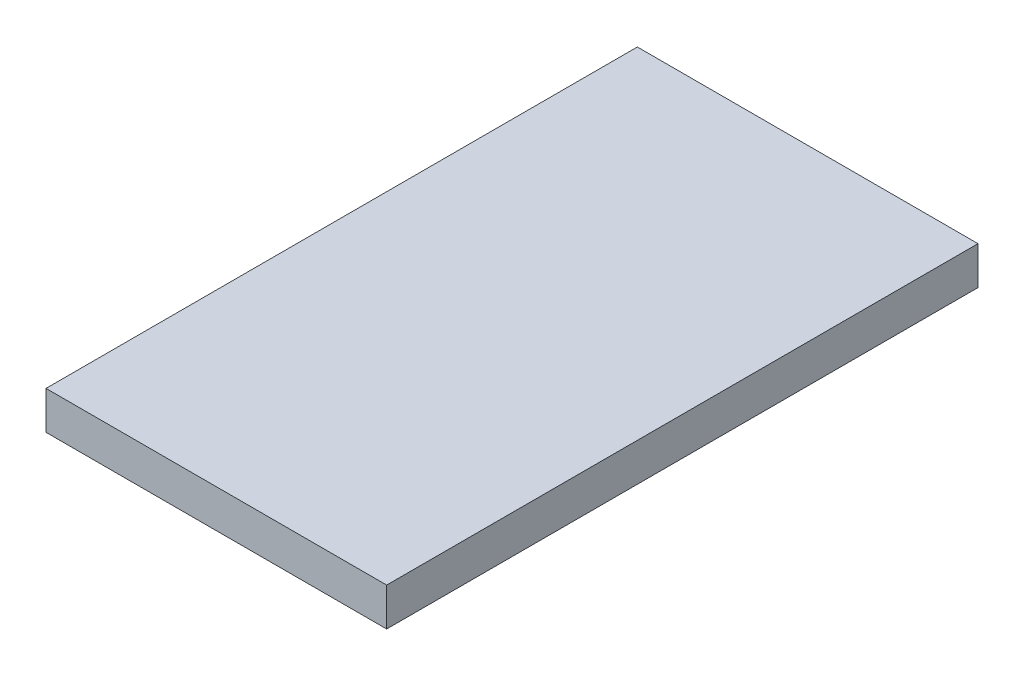
ISO-10303-21;
HEADER;
FILE_DESCRIPTION(('STEP AP214'),'2;1');
FILE_NAME('part.step','',(''),(''),'','','');
FILE_SCHEMA(('AUTOMOTIVE_DESIGN { 1 0 10303 214 1 1 1 1 }'));
ENDSEC;
DATA;
#1=APPLICATION_CONTEXT('core data for automotive mechanical design processes');
#2=APPLICATION_PROTOCOL_DEFINITION('international standard','automotive_design',2000,#1);
#3=PRODUCT_CONTEXT('',#1,'mechanical');
#4=PRODUCT('Part','Part','',(#3));
#5=PRODUCT_RELATED_PRODUCT_CATEGORY('part','',(#4));
#6=PRODUCT_DEFINITION_FORMATION('','',#4);
#7=PRODUCT_DEFINITION_CONTEXT('part definition',#1,'design');
#8=PRODUCT_DEFINITION('design','',#6,#7);
#9=PRODUCT_DEFINITION_SHAPE('','',#8);
#10=(LENGTH_UNIT() NAMED_UNIT(*) SI_UNIT(.MILLI.,.METRE.));
#11=(NAMED_UNIT(*) PLANE_ANGLE_UNIT() SI_UNIT($,.RADIAN.));
#12=(NAMED_UNIT(*) SI_UNIT($,.STERADIAN.) SOLID_ANGLE_UNIT());
#13=UNCERTAINTY_MEASURE_WITH_UNIT(LENGTH_MEASURE(1.E-05),#10,'distance_accuracy_value','');
#14=(GEOMETRIC_REPRESENTATION_CONTEXT(3) GLOBAL_UNCERTAINTY_ASSIGNED_CONTEXT((#13)) GLOBAL_UNIT_ASSIGNED_CONTEXT((#10,
#11,#12)) REPRESENTATION_CONTEXT('',''));
#15=CARTESIAN_POINT('',(0.,0.,0.));
#16=DIRECTION('',(0.,0.,1.));
#17=DIRECTION('',(1.,0.,0.));
#18=AXIS2_PLACEMENT_3D('',#15,#16,#17);
#19=CARTESIAN_POINT('',(-8.94715829199962,2.,-15.5309162804522));
#20=DIRECTION('',(0.,0.,-1.));
#21=DIRECTION('',(-1.,0.,0.));
#22=AXIS2_PLACEMENT_3D('',#19,#20,#21);
#23=PLANE('',#22);
#24=DIRECTION('',(1.,0.,0.));
#25=VECTOR('',#24,1.);
#26=CARTESIAN_POINT('',(-8.94715829199962,0.,-15.5309162804522));
#27=LINE('',#26,#25);
#28=CARTESIAN_POINT('',(-8.94715829199962,0.,-15.5309162804522));
#29=VERTEX_POINT('',#28);
#30=CARTESIAN_POINT('',(8.94715829199962,0.,-15.5309162804522));
#31=VERTEX_POINT('',#30);
#32=EDGE_CURVE('E116',#29,#31,#27,.T.);
#33=ORIENTED_EDGE('',*,*,#32,.F.);
#34=DIRECTION('',(0.,-1.,0.));
#35=VECTOR('',#34,1.);
#36=CARTESIAN_POINT('',(-8.94715829199962,2.,-15.5309162804522));
#37=LINE('',#36,#35);
#38=CARTESIAN_POINT('',(-8.94715829199962,2.,-15.5309162804522));
#39=VERTEX_POINT('',#38);
#40=EDGE_CURVE('E11',#39,#29,#37,.T.);
#41=ORIENTED_EDGE('',*,*,#40,.F.);
#42=DIRECTION('',(1.,0.,0.));
#43=VECTOR('',#42,1.);
#44=CARTESIAN_POINT('',(-8.94715829199962,2.,-15.5309162804522));
#45=LINE('',#44,#43);
#46=CARTESIAN_POINT('',(8.94715829199962,2.,-15.5309162804522));
#47=VERTEX_POINT('',#46);
#48=EDGE_CURVE('E109',#39,#47,#45,.T.);
#49=ORIENTED_EDGE('',*,*,#48,.T.);
#50=DIRECTION('',(0.,-1.,0.));
#51=VECTOR('',#50,1.);
#52=CARTESIAN_POINT('',(8.94715829199962,2.,-15.5309162804522));
#53=LINE('',#52,#51);
#54=EDGE_CURVE('E48',#47,#31,#53,.T.);
#55=ORIENTED_EDGE('',*,*,#54,.T.);
#56=EDGE_LOOP('',(#33,#41,#49,#55));
#57=FACE_BOUND('',#56,.T.);
#58=ADVANCED_FACE('F45',(#57),#23,.T.);
#59=CARTESIAN_POINT('',(-8.94715829199962,2.,-15.5309162804522));
#60=DIRECTION('',(1.,0.,0.));
#61=DIRECTION('',(0.,0.,-1.));
#62=AXIS2_PLACEMENT_3D('',#59,#60,#61);
#63=PLANE('',#62);
#64=DIRECTION('',(0.,0.,1.));
#65=VECTOR('',#64,1.);
#66=CARTESIAN_POINT('',(-8.94715829199962,0.,-15.5309162804522));
#67=LINE('',#66,#65);
#68=CARTESIAN_POINT('',(-8.94715829199962,0.,15.5309162804522));
#69=VERTEX_POINT('',#68);
#70=EDGE_CURVE('E79',#29,#69,#67,.T.);
#71=ORIENTED_EDGE('',*,*,#70,.T.);
#72=DIRECTION('',(0.,-1.,0.));
#73=VECTOR('',#72,1.);
#74=CARTESIAN_POINT('',(-8.94715829199962,2.,15.5309162804522));
#75=LINE('',#74,#73);
#76=CARTESIAN_POINT('',(-8.94715829199962,2.,15.5309162804522));
#77=VERTEX_POINT('',#76);
#78=EDGE_CURVE('E55',#77,#69,#75,.T.);
#79=ORIENTED_EDGE('',*,*,#78,.F.);
#80=DIRECTION('',(0.,0.,1.));
#81=VECTOR('',#80,1.);
#82=CARTESIAN_POINT('',(-8.94715829199962,2.,-15.5309162804522));
#83=LINE('',#82,#81);
#84=EDGE_CURVE('E96',#39,#77,#83,.T.);
#85=ORIENTED_EDGE('',*,*,#84,.F.);
#86=ORIENTED_EDGE('',*,*,#40,.T.);
#87=EDGE_LOOP('',(#71,#79,#85,#86));
#88=FACE_BOUND('',#87,.T.);
#89=ADVANCED_FACE('F132',(#88),#63,.F.);
#90=CARTESIAN_POINT('',(-8.94715829199962,2.,15.5309162804522));
#91=DIRECTION('',(0.,0.,-1.));
#92=DIRECTION('',(-1.,0.,0.));
#93=AXIS2_PLACEMENT_3D('',#90,#91,#92);
#94=PLANE('',#93);
#95=DIRECTION('',(1.,0.,0.));
#96=VECTOR('',#95,1.);
#97=CARTESIAN_POINT('',(-8.94715829199962,0.,15.5309162804522));
#98=LINE('',#97,#96);
#99=CARTESIAN_POINT('',(8.94715829199962,0.,15.5309162804522));
#100=VERTEX_POINT('',#99);
#101=EDGE_CURVE('E104',#69,#100,#98,.T.);
#102=ORIENTED_EDGE('',*,*,#101,.T.);
#103=DIRECTION('',(0.,-1.,0.));
#104=VECTOR('',#103,1.);
#105=CARTESIAN_POINT('',(8.94715829199962,2.,15.5309162804522));
#106=LINE('',#105,#104);
#107=CARTESIAN_POINT('',(8.94715829199962,2.,15.5309162804522));
#108=VERTEX_POINT('',#107);
#109=EDGE_CURVE('E101',#108,#100,#106,.T.);
#110=ORIENTED_EDGE('',*,*,#109,.F.);
#111=DIRECTION('',(1.,0.,0.));
#112=VECTOR('',#111,1.);
#113=CARTESIAN_POINT('',(-8.94715829199962,2.,15.5309162804522));
#114=LINE('',#113,#112);
#115=EDGE_CURVE('E91',#77,#108,#114,.T.);
#116=ORIENTED_EDGE('',*,*,#115,.F.);
#117=ORIENTED_EDGE('',*,*,#78,.T.);
#118=EDGE_LOOP('',(#102,#110,#116,#117));
#119=FACE_BOUND('',#118,.T.);
#120=ADVANCED_FACE('F102',(#119),#94,.F.);
#121=CARTESIAN_POINT('',(8.94715829199962,2.,-15.5309162804522));
#122=DIRECTION('',(1.,0.,0.));
#123=DIRECTION('',(0.,0.,-1.));
#124=AXIS2_PLACEMENT_3D('',#121,#122,#123);
#125=PLANE('',#124);
#126=DIRECTION('',(0.,0.,1.));
#127=VECTOR('',#126,1.);
#128=CARTESIAN_POINT('',(8.94715829199962,0.,-15.5309162804522));
#129=LINE('',#128,#127);
#130=EDGE_CURVE('E120',#31,#100,#129,.T.);
#131=ORIENTED_EDGE('',*,*,#130,.F.);
#132=ORIENTED_EDGE('',*,*,#54,.F.);
#133=DIRECTION('',(0.,0.,1.));
#134=VECTOR('',#133,1.);
#135=CARTESIAN_POINT('',(8.94715829199962,2.,-15.5309162804522));
#136=LINE('',#135,#134);
#137=EDGE_CURVE('E95',#47,#108,#136,.T.);
#138=ORIENTED_EDGE('',*,*,#137,.T.);
#139=ORIENTED_EDGE('',*,*,#109,.T.);
#140=EDGE_LOOP('',(#131,#132,#138,#139));
#141=FACE_BOUND('',#140,.T.);
#142=ADVANCED_FACE('F107',(#141),#125,.T.);
#143=CARTESIAN_POINT('',(0.,2.,0.));
#144=DIRECTION('',(0.,-1.,0.));
#145=DIRECTION('',(0.,0.,-1.));
#146=AXIS2_PLACEMENT_3D('',#143,#144,#145);
#147=PLANE('',#146);
#148=ORIENTED_EDGE('',*,*,#48,.F.);
#149=ORIENTED_EDGE('',*,*,#84,.T.);
#150=ORIENTED_EDGE('',*,*,#115,.T.);
#151=ORIENTED_EDGE('',*,*,#137,.F.);
#152=EDGE_LOOP('',(#148,#149,#150,#151));
#153=FACE_BOUND('',#152,.T.);
#154=ADVANCED_FACE('F94',(#153),#147,.F.);
#155=CARTESIAN_POINT('',(0.,0.,0.));
#156=DIRECTION('',(0.,-1.,0.));
#157=DIRECTION('',(0.,0.,-1.));
#158=AXIS2_PLACEMENT_3D('',#155,#156,#157);
#159=PLANE('',#158);
#160=ORIENTED_EDGE('',*,*,#32,.T.);
#161=ORIENTED_EDGE('',*,*,#130,.T.);
#162=ORIENTED_EDGE('',*,*,#101,.F.);
#163=ORIENTED_EDGE('',*,*,#70,.F.);
#164=EDGE_LOOP('',(#160,#161,#162,#163));
#165=FACE_BOUND('',#164,.T.);
#166=ADVANCED_FACE('F129',(#165),#159,.T.);
#167=CLOSED_SHELL('',(#58,#89,#120,#142,#154,#166));
#168=MANIFOLD_SOLID_BREP('B2',#167);
#169=ADVANCED_BREP_SHAPE_REPRESENTATION('',(#18,#168),#14);
#170=SHAPE_DEFINITION_REPRESENTATION(#9,#169);
ENDSEC;
END-ISO-10303-21;
